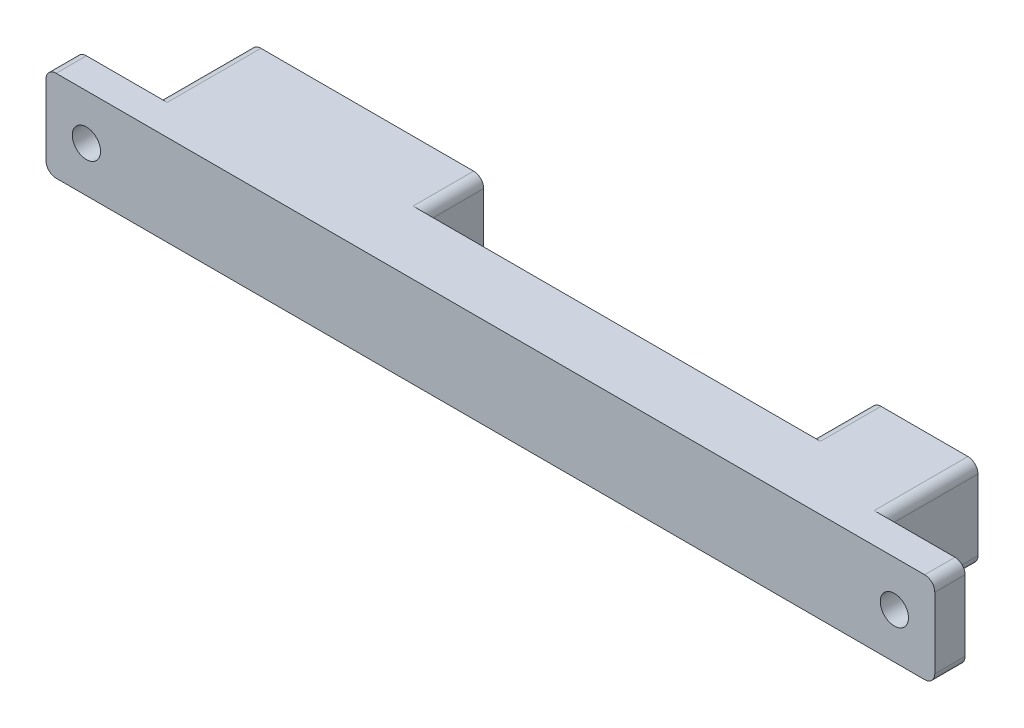
ISO-10303-21;
HEADER;
FILE_DESCRIPTION(('STEP AP214'),'2;1');
FILE_NAME('part.step','',(''),(''),'','','');
FILE_SCHEMA(('AUTOMOTIVE_DESIGN { 1 0 10303 214 1 1 1 1 }'));
ENDSEC;
DATA;
#1=APPLICATION_CONTEXT('core data for automotive mechanical design processes');
#2=APPLICATION_PROTOCOL_DEFINITION('international standard','automotive_design',2000,#1);
#3=PRODUCT_CONTEXT('',#1,'mechanical');
#4=PRODUCT('Part','Part','',(#3));
#5=PRODUCT_RELATED_PRODUCT_CATEGORY('part','',(#4));
#6=PRODUCT_DEFINITION_FORMATION('','',#4);
#7=PRODUCT_DEFINITION_CONTEXT('part definition',#1,'design');
#8=PRODUCT_DEFINITION('design','',#6,#7);
#9=PRODUCT_DEFINITION_SHAPE('','',#8);
#10=(LENGTH_UNIT() NAMED_UNIT(*) SI_UNIT(.MILLI.,.METRE.));
#11=(NAMED_UNIT(*) PLANE_ANGLE_UNIT() SI_UNIT($,.RADIAN.));
#12=(NAMED_UNIT(*) SI_UNIT($,.STERADIAN.) SOLID_ANGLE_UNIT());
#13=UNCERTAINTY_MEASURE_WITH_UNIT(LENGTH_MEASURE(1.E-05),#10,'distance_accuracy_value','');
#14=(GEOMETRIC_REPRESENTATION_CONTEXT(3) GLOBAL_UNCERTAINTY_ASSIGNED_CONTEXT((#13)) GLOBAL_UNIT_ASSIGNED_CONTEXT((#10,
#11,#12)) REPRESENTATION_CONTEXT('',''));
#15=CARTESIAN_POINT('',(0.,0.,0.));
#16=DIRECTION('',(0.,0.,1.));
#17=DIRECTION('',(1.,0.,0.));
#18=AXIS2_PLACEMENT_3D('',#15,#16,#17);
#19=CARTESIAN_POINT('',(-36.,0.,84.840319734687));
#20=DIRECTION('',(1.,0.,0.));
#21=DIRECTION('',(0.,0.,-1.));
#22=AXIS2_PLACEMENT_3D('',#19,#20,#21);
#23=PLANE('',#22);
#24=DIRECTION('',(0.,-1.,0.));
#25=VECTOR('',#24,1.);
#26=CARTESIAN_POINT('',(-36.,0.,0.));
#27=LINE('',#26,#25);
#28=CARTESIAN_POINT('',(-36.,27.4,0.));
#29=VERTEX_POINT('',#28);
#30=CARTESIAN_POINT('',(-36.,20.4,0.));
#31=VERTEX_POINT('',#30);
#32=EDGE_CURVE('E491',#29,#31,#27,.T.);
#33=ORIENTED_EDGE('',*,*,#32,.T.);
#34=DIRECTION('',(0.,0.,-1.));
#35=VECTOR('',#34,1.);
#36=CARTESIAN_POINT('',(-36.,20.4,84.840319734687));
#37=LINE('',#36,#35);
#38=CARTESIAN_POINT('',(-36.,20.4,9.28));
#39=VERTEX_POINT('',#38);
#40=EDGE_CURVE('E304',#31,#39,#37,.F.);
#41=ORIENTED_EDGE('',*,*,#40,.T.);
#42=DIRECTION('',(0.,-1.,0.));
#43=VECTOR('',#42,1.);
#44=CARTESIAN_POINT('',(-36.,0.,9.28));
#45=LINE('',#44,#43);
#46=CARTESIAN_POINT('',(-36.,27.4,9.28));
#47=VERTEX_POINT('',#46);
#48=EDGE_CURVE('E545',#47,#39,#45,.T.);
#49=ORIENTED_EDGE('',*,*,#48,.F.);
#50=DIRECTION('',(0.,0.,-1.));
#51=VECTOR('',#50,1.);
#52=CARTESIAN_POINT('',(-36.,27.4,0.));
#53=LINE('',#52,#51);
#54=EDGE_CURVE('E301',#47,#29,#53,.T.);
#55=ORIENTED_EDGE('',*,*,#54,.T.);
#56=EDGE_LOOP('',(#33,#41,#49,#55));
#57=FACE_BOUND('',#56,.T.);
#58=ADVANCED_FACE('F43',(#57),#23,.F.);
#59=CARTESIAN_POINT('',(0.,0.,0.));
#60=DIRECTION('',(0.,0.,1.));
#61=DIRECTION('',(1.,0.,0.));
#62=AXIS2_PLACEMENT_3D('',#59,#60,#61);
#63=PLANE('',#62);
#64=CARTESIAN_POINT('',(32.,23.9,0.));
#65=DIRECTION('',(0.,0.,1.));
#66=DIRECTION('',(1.,0.,0.));
#67=AXIS2_PLACEMENT_3D('',#64,#65,#66);
#68=CIRCLE('',#67,2.29999999999999);
#69=CARTESIAN_POINT('',(34.3,23.9,0.));
#70=VERTEX_POINT('',#69);
#71=EDGE_CURVE('E332',#70,#70,#68,.T.);
#72=ORIENTED_EDGE('',*,*,#71,.T.);
#73=EDGE_LOOP('',(#72));
#74=FACE_BOUND('',#73,.T.);
#75=DIRECTION('',(0.,1.,0.));
#76=VECTOR('',#75,1.);
#77=CARTESIAN_POINT('',(25.4,0.,0.));
#78=LINE('',#77,#76);
#79=CARTESIAN_POINT('',(25.4,20.4,0.));
#80=VERTEX_POINT('',#79);
#81=CARTESIAN_POINT('',(25.4,27.4,0.));
#82=VERTEX_POINT('',#81);
#83=EDGE_CURVE('E212',#80,#82,#78,.T.);
#84=ORIENTED_EDGE('',*,*,#83,.T.);
#85=CARTESIAN_POINT('',(26.4,27.4,0.));
#86=DIRECTION('',(0.,0.,1.));
#87=DIRECTION('',(1.,0.,0.));
#88=AXIS2_PLACEMENT_3D('',#85,#86,#87);
#89=CIRCLE('',#88,1.);
#90=CARTESIAN_POINT('',(26.4,28.4,0.));
#91=VERTEX_POINT('',#90);
#92=EDGE_CURVE('E207',#82,#91,#89,.F.);
#93=ORIENTED_EDGE('',*,*,#92,.T.);
#94=DIRECTION('',(1.,0.,0.));
#95=VECTOR('',#94,1.);
#96=CARTESIAN_POINT('',(0.,28.4,0.));
#97=LINE('',#96,#95);
#98=CARTESIAN_POINT('',(35.,28.4,0.));
#99=VERTEX_POINT('',#98);
#100=EDGE_CURVE('E210',#91,#99,#97,.T.);
#101=ORIENTED_EDGE('',*,*,#100,.T.);
#102=CARTESIAN_POINT('',(35.,27.4,0.));
#103=DIRECTION('',(0.,0.,1.));
#104=DIRECTION('',(1.,0.,0.));
#105=AXIS2_PLACEMENT_3D('',#102,#103,#104);
#106=CIRCLE('',#105,1.);
#107=CARTESIAN_POINT('',(36.,27.4,0.));
#108=VERTEX_POINT('',#107);
#109=EDGE_CURVE('E277',#99,#108,#106,.F.);
#110=ORIENTED_EDGE('',*,*,#109,.T.);
#111=DIRECTION('',(0.,-1.,0.));
#112=VECTOR('',#111,1.);
#113=CARTESIAN_POINT('',(36.,0.,0.));
#114=LINE('',#113,#112);
#115=CARTESIAN_POINT('',(36.,20.4,0.));
#116=VERTEX_POINT('',#115);
#117=EDGE_CURVE('E486',#108,#116,#114,.T.);
#118=ORIENTED_EDGE('',*,*,#117,.T.);
#119=CARTESIAN_POINT('',(35.,20.4,0.));
#120=DIRECTION('',(0.,0.,1.));
#121=DIRECTION('',(1.,0.,0.));
#122=AXIS2_PLACEMENT_3D('',#119,#120,#121);
#123=CIRCLE('',#122,1.);
#124=CARTESIAN_POINT('',(35.,19.4,0.));
#125=VERTEX_POINT('',#124);
#126=EDGE_CURVE('E275',#116,#125,#123,.F.);
#127=ORIENTED_EDGE('',*,*,#126,.T.);
#128=DIRECTION('',(1.,0.,0.));
#129=VECTOR('',#128,1.);
#130=CARTESIAN_POINT('',(0.,19.4,0.));
#131=LINE('',#130,#129);
#132=CARTESIAN_POINT('',(26.4,19.4,0.));
#133=VERTEX_POINT('',#132);
#134=EDGE_CURVE('E493',#133,#125,#131,.T.);
#135=ORIENTED_EDGE('',*,*,#134,.F.);
#136=CARTESIAN_POINT('',(26.4,20.4,0.));
#137=DIRECTION('',(0.,0.,1.));
#138=DIRECTION('',(1.,0.,0.));
#139=AXIS2_PLACEMENT_3D('',#136,#137,#138);
#140=CIRCLE('',#139,1.);
#141=EDGE_CURVE('E218',#133,#80,#140,.F.);
#142=ORIENTED_EDGE('',*,*,#141,.T.);
#143=EDGE_LOOP('',(#84,#93,#101,#110,#118,#127,#135,#142));
#144=FACE_BOUND('',#143,.T.);
#145=ADVANCED_FACE('F209',(#74,#144),#63,.F.);
#146=CARTESIAN_POINT('',(0.,19.4,84.840319734687));
#147=DIRECTION('',(0.,1.,0.));
#148=DIRECTION('',(0.,0.,1.));
#149=AXIS2_PLACEMENT_3D('',#146,#147,#148);
#150=PLANE('',#149);
#151=CARTESIAN_POINT('',(-35.,19.4,0.));
#152=VERTEX_POINT('',#151);
#153=CARTESIAN_POINT('',(-13.94,19.4,0.));
#154=VERTEX_POINT('',#153);
#155=EDGE_CURVE('E496',#152,#154,#131,.T.);
#156=ORIENTED_EDGE('',*,*,#155,.T.);
#157=DIRECTION('',(0.,0.,-1.));
#158=VECTOR('',#157,1.);
#159=CARTESIAN_POINT('',(-13.94,19.4,84.840319734687));
#160=LINE('',#159,#158);
#161=CARTESIAN_POINT('',(-13.94,19.4,6.));
#162=VERTEX_POINT('',#161);
#163=EDGE_CURVE('E268',#154,#162,#160,.F.);
#164=ORIENTED_EDGE('',*,*,#163,.T.);
#165=DIRECTION('',(1.,0.,0.));
#166=VECTOR('',#165,1.);
#167=CARTESIAN_POINT('',(0.,19.4,6.));
#168=LINE('',#167,#166);
#169=CARTESIAN_POINT('',(26.4,19.4,6.));
#170=VERTEX_POINT('',#169);
#171=EDGE_CURVE('E470',#162,#170,#168,.T.);
#172=ORIENTED_EDGE('',*,*,#171,.T.);
#173=DIRECTION('',(0.,0.,-1.));
#174=VECTOR('',#173,1.);
#175=CARTESIAN_POINT('',(26.4,19.4,0.));
#176=LINE('',#175,#174);
#177=EDGE_CURVE('E265',#170,#133,#176,.T.);
#178=ORIENTED_EDGE('',*,*,#177,.T.);
#179=ORIENTED_EDGE('',*,*,#134,.T.);
#180=DIRECTION('',(0.,0.,-1.));
#181=VECTOR('',#180,1.);
#182=CARTESIAN_POINT('',(35.,19.4,9.28));
#183=LINE('',#182,#181);
#184=CARTESIAN_POINT('',(35.,19.4,9.28));
#185=VERTEX_POINT('',#184);
#186=EDGE_CURVE('E262',#125,#185,#183,.F.);
#187=ORIENTED_EDGE('',*,*,#186,.T.);
#188=DIRECTION('',(1.,0.,0.));
#189=VECTOR('',#188,1.);
#190=CARTESIAN_POINT('',(0.,19.4,9.28));
#191=LINE('',#190,#189);
#192=CARTESIAN_POINT('',(43.,19.4,9.28));
#193=VERTEX_POINT('',#192);
#194=EDGE_CURVE('E446',#185,#193,#191,.T.);
#195=ORIENTED_EDGE('',*,*,#194,.T.);
#196=DIRECTION('',(0.,0.,1.));
#197=VECTOR('',#196,1.);
#198=CARTESIAN_POINT('',(43.,19.4,12.28));
#199=LINE('',#198,#197);
#200=CARTESIAN_POINT('',(43.,19.4,12.28));
#201=VERTEX_POINT('',#200);
#202=EDGE_CURVE('E259',#193,#201,#199,.T.);
#203=ORIENTED_EDGE('',*,*,#202,.T.);
#204=DIRECTION('',(1.,0.,0.));
#205=VECTOR('',#204,1.);
#206=CARTESIAN_POINT('',(0.,19.4,12.28));
#207=LINE('',#206,#205);
#208=CARTESIAN_POINT('',(-43.,19.4,12.28));
#209=VERTEX_POINT('',#208);
#210=EDGE_CURVE('E483',#209,#201,#207,.T.);
#211=ORIENTED_EDGE('',*,*,#210,.F.);
#212=DIRECTION('',(0.,0.,1.));
#213=VECTOR('',#212,1.);
#214=CARTESIAN_POINT('',(-43.,19.4,84.840319734687));
#215=LINE('',#214,#213);
#216=CARTESIAN_POINT('',(-43.,19.4,9.28));
#217=VERTEX_POINT('',#216);
#218=EDGE_CURVE('E254',#209,#217,#215,.F.);
#219=ORIENTED_EDGE('',*,*,#218,.T.);
#220=DIRECTION('',(-1.,0.,0.));
#221=VECTOR('',#220,1.);
#222=CARTESIAN_POINT('',(0.,19.4,9.28));
#223=LINE('',#222,#221);
#224=CARTESIAN_POINT('',(-35.,19.4,9.28));
#225=VERTEX_POINT('',#224);
#226=EDGE_CURVE('E547',#225,#217,#223,.T.);
#227=ORIENTED_EDGE('',*,*,#226,.F.);
#228=DIRECTION('',(0.,0.,-1.));
#229=VECTOR('',#228,1.);
#230=CARTESIAN_POINT('',(-35.,19.4,84.840319734687));
#231=LINE('',#230,#229);
#232=EDGE_CURVE('E256',#225,#152,#231,.T.);
#233=ORIENTED_EDGE('',*,*,#232,.T.);
#234=EDGE_LOOP('',(#156,#164,#172,#178,#179,#187,#195,#203,#211,#219,#227,#233));
#235=FACE_BOUND('',#234,.T.);
#236=ADVANCED_FACE('F360',(#235),#150,.F.);
#237=CARTESIAN_POINT('',(0.,28.4,84.840319734687));
#238=DIRECTION('',(0.,1.,0.));
#239=DIRECTION('',(0.,0.,1.));
#240=AXIS2_PLACEMENT_3D('',#237,#238,#239);
#241=PLANE('',#240);
#242=DIRECTION('',(1.,0.,0.));
#243=VECTOR('',#242,1.);
#244=CARTESIAN_POINT('',(0.,28.4,6.));
#245=LINE('',#244,#243);
#246=CARTESIAN_POINT('',(-13.94,28.4,6.));
#247=VERTEX_POINT('',#246);
#248=CARTESIAN_POINT('',(26.4,28.4,6.));
#249=VERTEX_POINT('',#248);
#250=EDGE_CURVE('E476',#247,#249,#245,.T.);
#251=ORIENTED_EDGE('',*,*,#250,.F.);
#252=DIRECTION('',(0.,0.,-1.));
#253=VECTOR('',#252,1.);
#254=CARTESIAN_POINT('',(-13.94,28.4,0.));
#255=LINE('',#254,#253);
#256=CARTESIAN_POINT('',(-13.94,28.4,0.));
#257=VERTEX_POINT('',#256);
#258=EDGE_CURVE('E233',#247,#257,#255,.T.);
#259=ORIENTED_EDGE('',*,*,#258,.T.);
#260=CARTESIAN_POINT('',(-35.,28.4,0.));
#261=VERTEX_POINT('',#260);
#262=EDGE_CURVE('E228',#261,#257,#97,.T.);
#263=ORIENTED_EDGE('',*,*,#262,.F.);
#264=DIRECTION('',(0.,0.,-1.));
#265=VECTOR('',#264,1.);
#266=CARTESIAN_POINT('',(-35.,28.4,9.28));
#267=LINE('',#266,#265);
#268=CARTESIAN_POINT('',(-35.,28.4,9.28));
#269=VERTEX_POINT('',#268);
#270=EDGE_CURVE('E501',#261,#269,#267,.F.);
#271=ORIENTED_EDGE('',*,*,#270,.T.);
#272=DIRECTION('',(-1.,0.,0.));
#273=VECTOR('',#272,1.);
#274=CARTESIAN_POINT('',(0.,28.4,9.28));
#275=LINE('',#274,#273);
#276=CARTESIAN_POINT('',(-43.,28.4,9.28));
#277=VERTEX_POINT('',#276);
#278=EDGE_CURVE('E469',#269,#277,#275,.T.);
#279=ORIENTED_EDGE('',*,*,#278,.T.);
#280=DIRECTION('',(0.,0.,1.));
#281=VECTOR('',#280,1.);
#282=CARTESIAN_POINT('',(-43.,28.4,12.28));
#283=LINE('',#282,#281);
#284=CARTESIAN_POINT('',(-43.,28.4,12.28));
#285=VERTEX_POINT('',#284);
#286=EDGE_CURVE('E488',#277,#285,#283,.T.);
#287=ORIENTED_EDGE('',*,*,#286,.T.);
#288=DIRECTION('',(1.,0.,0.));
#289=VECTOR('',#288,1.);
#290=CARTESIAN_POINT('',(0.,28.4,12.28));
#291=LINE('',#290,#289);
#292=CARTESIAN_POINT('',(43.,28.4,12.28));
#293=VERTEX_POINT('',#292);
#294=EDGE_CURVE('E485',#285,#293,#291,.T.);
#295=ORIENTED_EDGE('',*,*,#294,.T.);
#296=DIRECTION('',(0.,0.,1.));
#297=VECTOR('',#296,1.);
#298=CARTESIAN_POINT('',(43.,28.4,84.840319734687));
#299=LINE('',#298,#297);
#300=CARTESIAN_POINT('',(43.,28.4,9.28));
#301=VERTEX_POINT('',#300);
#302=EDGE_CURVE('E238',#293,#301,#299,.F.);
#303=ORIENTED_EDGE('',*,*,#302,.T.);
#304=DIRECTION('',(1.,0.,0.));
#305=VECTOR('',#304,1.);
#306=CARTESIAN_POINT('',(0.,28.4,9.28));
#307=LINE('',#306,#305);
#308=CARTESIAN_POINT('',(35.,28.4,9.28));
#309=VERTEX_POINT('',#308);
#310=EDGE_CURVE('E453',#309,#301,#307,.T.);
#311=ORIENTED_EDGE('',*,*,#310,.F.);
#312=DIRECTION('',(0.,0.,-1.));
#313=VECTOR('',#312,1.);
#314=CARTESIAN_POINT('',(35.,28.4,84.840319734687));
#315=LINE('',#314,#313);
#316=EDGE_CURVE('E227',#309,#99,#315,.T.);
#317=ORIENTED_EDGE('',*,*,#316,.T.);
#318=ORIENTED_EDGE('',*,*,#100,.F.);
#319=DIRECTION('',(0.,0.,-1.));
#320=VECTOR('',#319,1.);
#321=CARTESIAN_POINT('',(26.4,28.4,84.840319734687));
#322=LINE('',#321,#320);
#323=EDGE_CURVE('E224',#91,#249,#322,.F.);
#324=ORIENTED_EDGE('',*,*,#323,.T.);
#325=EDGE_LOOP('',(#251,#259,#263,#271,#279,#287,#295,#303,#311,#317,#318,#324));
#326=FACE_BOUND('',#325,.T.);
#327=ADVANCED_FACE('F223',(#326),#241,.T.);
#328=CARTESIAN_POINT('',(-32.,23.9,0.));
#329=DIRECTION('',(0.,0.,1.));
#330=DIRECTION('',(1.,0.,0.));
#331=AXIS2_PLACEMENT_3D('',#328,#329,#330);
#332=CIRCLE('',#331,2.29999999999999);
#333=CARTESIAN_POINT('',(-29.7,23.9,0.));
#334=VERTEX_POINT('',#333);
#335=EDGE_CURVE('E52',#334,#334,#332,.T.);
#336=ORIENTED_EDGE('',*,*,#335,.T.);
#337=EDGE_LOOP('',(#336));
#338=FACE_BOUND('',#337,.T.);
#339=ORIENTED_EDGE('',*,*,#262,.T.);
#340=CARTESIAN_POINT('',(-13.94,27.4,0.));
#341=DIRECTION('',(0.,0.,1.));
#342=DIRECTION('',(1.,0.,0.));
#343=AXIS2_PLACEMENT_3D('',#340,#341,#342);
#344=CIRCLE('',#343,1.);
#345=CARTESIAN_POINT('',(-12.94,27.4,0.));
#346=VERTEX_POINT('',#345);
#347=EDGE_CURVE('E247',#257,#346,#344,.F.);
#348=ORIENTED_EDGE('',*,*,#347,.T.);
#349=DIRECTION('',(0.,1.,0.));
#350=VECTOR('',#349,1.);
#351=CARTESIAN_POINT('',(-12.94,0.,0.));
#352=LINE('',#351,#350);
#353=CARTESIAN_POINT('',(-12.94,20.4,0.));
#354=VERTEX_POINT('',#353);
#355=EDGE_CURVE('E473',#354,#346,#352,.T.);
#356=ORIENTED_EDGE('',*,*,#355,.F.);
#357=CARTESIAN_POINT('',(-13.94,20.4,0.));
#358=DIRECTION('',(0.,0.,1.));
#359=DIRECTION('',(1.,0.,0.));
#360=AXIS2_PLACEMENT_3D('',#357,#358,#359);
#361=CIRCLE('',#360,1.);
#362=EDGE_CURVE('E245',#354,#154,#361,.F.);
#363=ORIENTED_EDGE('',*,*,#362,.T.);
#364=ORIENTED_EDGE('',*,*,#155,.F.);
#365=CARTESIAN_POINT('',(-35.,20.4,0.));
#366=DIRECTION('',(0.,0.,1.));
#367=DIRECTION('',(1.,0.,0.));
#368=AXIS2_PLACEMENT_3D('',#365,#366,#367);
#369=CIRCLE('',#368,1.);
#370=EDGE_CURVE('E243',#152,#31,#369,.F.);
#371=ORIENTED_EDGE('',*,*,#370,.T.);
#372=ORIENTED_EDGE('',*,*,#32,.F.);
#373=CARTESIAN_POINT('',(-35.,27.4,0.));
#374=DIRECTION('',(0.,0.,1.));
#375=DIRECTION('',(1.,0.,0.));
#376=AXIS2_PLACEMENT_3D('',#373,#374,#375);
#377=CIRCLE('',#376,1.);
#378=EDGE_CURVE('E236',#29,#261,#377,.F.);
#379=ORIENTED_EDGE('',*,*,#378,.T.);
#380=EDGE_LOOP('',(#339,#348,#356,#363,#364,#371,#372,#379));
#381=FACE_BOUND('',#380,.T.);
#382=ADVANCED_FACE('F340',(#338,#381),#63,.F.);
#383=CARTESIAN_POINT('',(36.,0.,84.840319734687));
#384=DIRECTION('',(1.,0.,0.));
#385=DIRECTION('',(0.,0.,-1.));
#386=AXIS2_PLACEMENT_3D('',#383,#384,#385);
#387=PLANE('',#386);
#388=ORIENTED_EDGE('',*,*,#117,.F.);
#389=DIRECTION('',(0.,0.,-1.));
#390=VECTOR('',#389,1.);
#391=CARTESIAN_POINT('',(36.,27.4,84.840319734687));
#392=LINE('',#391,#390);
#393=CARTESIAN_POINT('',(36.,27.4,9.28));
#394=VERTEX_POINT('',#393);
#395=EDGE_CURVE('E282',#108,#394,#392,.F.);
#396=ORIENTED_EDGE('',*,*,#395,.T.);
#397=DIRECTION('',(0.,1.,0.));
#398=VECTOR('',#397,1.);
#399=CARTESIAN_POINT('',(36.,0.,9.28));
#400=LINE('',#399,#398);
#401=CARTESIAN_POINT('',(36.,20.4,9.28));
#402=VERTEX_POINT('',#401);
#403=EDGE_CURVE('E439',#402,#394,#400,.T.);
#404=ORIENTED_EDGE('',*,*,#403,.F.);
#405=DIRECTION('',(0.,0.,-1.));
#406=VECTOR('',#405,1.);
#407=CARTESIAN_POINT('',(36.,20.4,0.));
#408=LINE('',#407,#406);
#409=EDGE_CURVE('E217',#402,#116,#408,.T.);
#410=ORIENTED_EDGE('',*,*,#409,.T.);
#411=EDGE_LOOP('',(#388,#396,#404,#410));
#412=FACE_BOUND('',#411,.T.);
#413=ADVANCED_FACE('F523',(#412),#387,.T.);
#414=CARTESIAN_POINT('',(-18.6226918113002,29.4606526095627,12.28));
#415=DIRECTION('',(0.,0.,1.));
#416=DIRECTION('',(1.,0.,0.));
#417=AXIS2_PLACEMENT_3D('',#414,#415,#416);
#418=PLANE('',#417);
#419=ORIENTED_EDGE('',*,*,#210,.T.);
#420=CARTESIAN_POINT('',(43.,20.4,12.28));
#421=DIRECTION('',(0.,0.,1.));
#422=DIRECTION('',(1.,0.,0.));
#423=AXIS2_PLACEMENT_3D('',#420,#421,#422);
#424=CIRCLE('',#423,1.);
#425=CARTESIAN_POINT('',(44.,20.4,12.28));
#426=VERTEX_POINT('',#425);
#427=EDGE_CURVE('E290',#201,#426,#424,.T.);
#428=ORIENTED_EDGE('',*,*,#427,.T.);
#429=DIRECTION('',(0.,1.,0.));
#430=VECTOR('',#429,1.);
#431=CARTESIAN_POINT('',(44.,0.,12.28));
#432=LINE('',#431,#430);
#433=CARTESIAN_POINT('',(44.,27.4,12.28));
#434=VERTEX_POINT('',#433);
#435=EDGE_CURVE('E447',#426,#434,#432,.T.);
#436=ORIENTED_EDGE('',*,*,#435,.T.);
#437=CARTESIAN_POINT('',(43.,27.4,12.28));
#438=DIRECTION('',(0.,0.,1.));
#439=DIRECTION('',(1.,0.,0.));
#440=AXIS2_PLACEMENT_3D('',#437,#438,#439);
#441=CIRCLE('',#440,1.);
#442=EDGE_CURVE('E288',#434,#293,#441,.T.);
#443=ORIENTED_EDGE('',*,*,#442,.T.);
#444=ORIENTED_EDGE('',*,*,#294,.F.);
#445=CARTESIAN_POINT('',(-43.,27.4,12.28));
#446=DIRECTION('',(0.,0.,1.));
#447=DIRECTION('',(1.,0.,0.));
#448=AXIS2_PLACEMENT_3D('',#445,#446,#447);
#449=CIRCLE('',#448,1.);
#450=CARTESIAN_POINT('',(-44.,27.4,12.28));
#451=VERTEX_POINT('',#450);
#452=EDGE_CURVE('E286',#285,#451,#449,.T.);
#453=ORIENTED_EDGE('',*,*,#452,.T.);
#454=DIRECTION('',(0.,1.,0.));
#455=VECTOR('',#454,1.);
#456=CARTESIAN_POINT('',(-44.,0.,12.28));
#457=LINE('',#456,#455);
#458=CARTESIAN_POINT('',(-44.,20.4,12.28));
#459=VERTEX_POINT('',#458);
#460=EDGE_CURVE('E425',#459,#451,#457,.T.);
#461=ORIENTED_EDGE('',*,*,#460,.F.);
#462=CARTESIAN_POINT('',(-43.,20.4,12.28));
#463=DIRECTION('',(0.,0.,1.));
#464=DIRECTION('',(1.,0.,0.));
#465=AXIS2_PLACEMENT_3D('',#462,#463,#464);
#466=CIRCLE('',#465,1.);
#467=EDGE_CURVE('E284',#459,#209,#466,.T.);
#468=ORIENTED_EDGE('',*,*,#467,.T.);
#469=EDGE_LOOP('',(#419,#428,#436,#443,#444,#453,#461,#468));
#470=FACE_BOUND('',#469,.T.);
#471=CARTESIAN_POINT('',(-40.,23.9,12.28));
#472=DIRECTION('',(0.,0.,1.));
#473=DIRECTION('',(1.,0.,0.));
#474=AXIS2_PLACEMENT_3D('',#471,#472,#473);
#475=CIRCLE('',#474,1.4);
#476=CARTESIAN_POINT('',(-38.6,23.9,12.28));
#477=VERTEX_POINT('',#476);
#478=EDGE_CURVE('E434',#477,#477,#475,.T.);
#479=ORIENTED_EDGE('',*,*,#478,.F.);
#480=EDGE_LOOP('',(#479));
#481=FACE_BOUND('',#480,.T.);
#482=CARTESIAN_POINT('',(40.,23.9,12.28));
#483=DIRECTION('',(0.,0.,1.));
#484=DIRECTION('',(1.,0.,0.));
#485=AXIS2_PLACEMENT_3D('',#482,#483,#484);
#486=CIRCLE('',#485,1.4);
#487=CARTESIAN_POINT('',(41.4,23.9,12.28));
#488=VERTEX_POINT('',#487);
#489=EDGE_CURVE('E458',#488,#488,#486,.T.);
#490=ORIENTED_EDGE('',*,*,#489,.F.);
#491=EDGE_LOOP('',(#490));
#492=FACE_BOUND('',#491,.T.);
#493=ADVANCED_FACE('F429',(#470,#481,#492),#418,.T.);
#494=CARTESIAN_POINT('',(25.4,0.,6.));
#495=DIRECTION('',(-1.,0.,0.));
#496=DIRECTION('',(0.,0.,1.));
#497=AXIS2_PLACEMENT_3D('',#494,#495,#496);
#498=PLANE('',#497);
#499=DIRECTION('',(0.,1.,0.));
#500=VECTOR('',#499,1.);
#501=CARTESIAN_POINT('',(25.4,0.,6.));
#502=LINE('',#501,#500);
#503=CARTESIAN_POINT('',(25.4,20.4,6.));
#504=VERTEX_POINT('',#503);
#505=CARTESIAN_POINT('',(25.4,27.4,6.));
#506=VERTEX_POINT('',#505);
#507=EDGE_CURVE('E472',#504,#506,#502,.T.);
#508=ORIENTED_EDGE('',*,*,#507,.T.);
#509=DIRECTION('',(0.,0.,-1.));
#510=VECTOR('',#509,1.);
#511=CARTESIAN_POINT('',(25.4,27.4,6.));
#512=LINE('',#511,#510);
#513=EDGE_CURVE('E273',#506,#82,#512,.T.);
#514=ORIENTED_EDGE('',*,*,#513,.T.);
#515=ORIENTED_EDGE('',*,*,#83,.F.);
#516=DIRECTION('',(0.,0.,-1.));
#517=VECTOR('',#516,1.);
#518=CARTESIAN_POINT('',(25.4,20.4,6.00000000000001));
#519=LINE('',#518,#517);
#520=EDGE_CURVE('E271',#80,#504,#519,.F.);
#521=ORIENTED_EDGE('',*,*,#520,.T.);
#522=EDGE_LOOP('',(#508,#514,#515,#521));
#523=FACE_BOUND('',#522,.T.);
#524=ADVANCED_FACE('F530',(#523),#498,.T.);
#525=CARTESIAN_POINT('',(-12.94,0.,6.));
#526=DIRECTION('',(-1.,0.,0.));
#527=DIRECTION('',(0.,0.,1.));
#528=AXIS2_PLACEMENT_3D('',#525,#526,#527);
#529=PLANE('',#528);
#530=ORIENTED_EDGE('',*,*,#355,.T.);
#531=DIRECTION('',(0.,0.,-1.));
#532=VECTOR('',#531,1.);
#533=CARTESIAN_POINT('',(-12.94,27.4,6.00000000000001));
#534=LINE('',#533,#532);
#535=CARTESIAN_POINT('',(-12.94,27.4,6.));
#536=VERTEX_POINT('',#535);
#537=EDGE_CURVE('E252',#346,#536,#534,.F.);
#538=ORIENTED_EDGE('',*,*,#537,.T.);
#539=DIRECTION('',(0.,1.,0.));
#540=VECTOR('',#539,1.);
#541=CARTESIAN_POINT('',(-12.94,0.,6.));
#542=LINE('',#541,#540);
#543=CARTESIAN_POINT('',(-12.94,20.4,6.));
#544=VERTEX_POINT('',#543);
#545=EDGE_CURVE('E229',#544,#536,#542,.T.);
#546=ORIENTED_EDGE('',*,*,#545,.F.);
#547=DIRECTION('',(0.,0.,-1.));
#548=VECTOR('',#547,1.);
#549=CARTESIAN_POINT('',(-12.94,20.4,6.));
#550=LINE('',#549,#548);
#551=EDGE_CURVE('E249',#544,#354,#550,.T.);
#552=ORIENTED_EDGE('',*,*,#551,.T.);
#553=EDGE_LOOP('',(#530,#538,#546,#552));
#554=FACE_BOUND('',#553,.T.);
#555=ADVANCED_FACE('F593',(#554),#529,.F.);
#556=CARTESIAN_POINT('',(0.,0.,6.));
#557=DIRECTION('',(0.,0.,1.));
#558=DIRECTION('',(1.,0.,0.));
#559=AXIS2_PLACEMENT_3D('',#556,#557,#558);
#560=PLANE('',#559);
#561=ORIENTED_EDGE('',*,*,#171,.F.);
#562=CARTESIAN_POINT('',(-13.94,20.4,6.));
#563=DIRECTION('',(0.,0.,1.));
#564=DIRECTION('',(1.,0.,0.));
#565=AXIS2_PLACEMENT_3D('',#562,#563,#564);
#566=CIRCLE('',#565,1.);
#567=EDGE_CURVE('E316',#162,#544,#566,.T.);
#568=ORIENTED_EDGE('',*,*,#567,.T.);
#569=ORIENTED_EDGE('',*,*,#545,.T.);
#570=CARTESIAN_POINT('',(-13.94,27.4,6.00000000000001));
#571=DIRECTION('',(0.,0.,1.));
#572=DIRECTION('',(1.,0.,0.));
#573=AXIS2_PLACEMENT_3D('',#570,#571,#572);
#574=CIRCLE('',#573,1.);
#575=EDGE_CURVE('E313',#536,#247,#574,.T.);
#576=ORIENTED_EDGE('',*,*,#575,.T.);
#577=ORIENTED_EDGE('',*,*,#250,.T.);
#578=CARTESIAN_POINT('',(26.4,27.4,6.));
#579=DIRECTION('',(0.,0.,1.));
#580=DIRECTION('',(1.,0.,0.));
#581=AXIS2_PLACEMENT_3D('',#578,#579,#580);
#582=CIRCLE('',#581,1.);
#583=EDGE_CURVE('E232',#249,#506,#582,.T.);
#584=ORIENTED_EDGE('',*,*,#583,.T.);
#585=ORIENTED_EDGE('',*,*,#507,.F.);
#586=CARTESIAN_POINT('',(26.4,20.4,6.00000000000001));
#587=DIRECTION('',(0.,0.,1.));
#588=DIRECTION('',(1.,0.,0.));
#589=AXIS2_PLACEMENT_3D('',#586,#587,#588);
#590=CIRCLE('',#589,1.);
#591=EDGE_CURVE('E319',#504,#170,#590,.T.);
#592=ORIENTED_EDGE('',*,*,#591,.T.);
#593=EDGE_LOOP('',(#561,#568,#569,#576,#577,#584,#585,#592));
#594=FACE_BOUND('',#593,.T.);
#595=ADVANCED_FACE('F533',(#594),#560,.F.);
#596=CARTESIAN_POINT('',(-32.,23.9,8.));
#597=DIRECTION('',(0.,0.,-1.));
#598=DIRECTION('',(-1.,0.,0.));
#599=AXIS2_PLACEMENT_3D('',#596,#597,#598);
#600=CYLINDRICAL_SURFACE('',#599,1.8);
#601=CARTESIAN_POINT('',(-32.,23.9,0.499999999999981));
#602=DIRECTION('',(0.,0.,1.));
#603=DIRECTION('',(1.,0.,0.));
#604=AXIS2_PLACEMENT_3D('',#601,#602,#603);
#605=CIRCLE('',#604,1.8);
#606=CARTESIAN_POINT('',(-30.2,23.9,0.499999999999981));
#607=VERTEX_POINT('',#606);
#608=EDGE_CURVE('E11',#607,#607,#605,.F.);
#609=ORIENTED_EDGE('',*,*,#608,.T.);
#610=EDGE_LOOP('',(#609));
#611=FACE_BOUND('',#610,.T.);
#612=CARTESIAN_POINT('',(-32.,23.9,8.));
#613=DIRECTION('',(0.,0.,1.));
#614=DIRECTION('',(1.,0.,0.));
#615=AXIS2_PLACEMENT_3D('',#612,#613,#614);
#616=CIRCLE('',#615,1.8);
#617=CARTESIAN_POINT('',(-30.2,23.9,8.));
#618=VERTEX_POINT('',#617);
#619=EDGE_CURVE('E463',#618,#618,#616,.T.);
#620=ORIENTED_EDGE('',*,*,#619,.T.);
#621=EDGE_LOOP('',(#620));
#622=FACE_BOUND('',#621,.T.);
#623=ADVANCED_FACE('F580',(#611,#622),#600,.F.);
#624=CARTESIAN_POINT('',(0.,0.,8.));
#625=DIRECTION('',(0.,0.,1.));
#626=DIRECTION('',(1.,0.,0.));
#627=AXIS2_PLACEMENT_3D('',#624,#625,#626);
#628=PLANE('',#627);
#629=ORIENTED_EDGE('',*,*,#619,.F.);
#630=EDGE_LOOP('',(#629));
#631=FACE_BOUND('',#630,.T.);
#632=ADVANCED_FACE('F576',(#631),#628,.F.);
#633=CARTESIAN_POINT('',(32.,23.9,8.));
#634=DIRECTION('',(0.,0.,-1.));
#635=DIRECTION('',(-1.,0.,0.));
#636=AXIS2_PLACEMENT_3D('',#633,#634,#635);
#637=CYLINDRICAL_SURFACE('',#636,1.8);
#638=CARTESIAN_POINT('',(32.,23.9,0.499999999999999));
#639=DIRECTION('',(0.,0.,1.));
#640=DIRECTION('',(1.,0.,0.));
#641=AXIS2_PLACEMENT_3D('',#638,#639,#640);
#642=CIRCLE('',#641,1.8);
#643=CARTESIAN_POINT('',(33.8,23.9,0.499999999999999));
#644=VERTEX_POINT('',#643);
#645=EDGE_CURVE('E335',#644,#644,#642,.F.);
#646=ORIENTED_EDGE('',*,*,#645,.T.);
#647=EDGE_LOOP('',(#646));
#648=FACE_BOUND('',#647,.T.);
#649=CARTESIAN_POINT('',(32.,23.9,8.));
#650=DIRECTION('',(0.,0.,1.));
#651=DIRECTION('',(1.,0.,0.));
#652=AXIS2_PLACEMENT_3D('',#649,#650,#651);
#653=CIRCLE('',#652,1.8);
#654=CARTESIAN_POINT('',(33.8,23.9,8.));
#655=VERTEX_POINT('',#654);
#656=EDGE_CURVE('E466',#655,#655,#653,.T.);
#657=ORIENTED_EDGE('',*,*,#656,.T.);
#658=EDGE_LOOP('',(#657));
#659=FACE_BOUND('',#658,.T.);
#660=ADVANCED_FACE('F579',(#648,#659),#637,.F.);
#661=CARTESIAN_POINT('',(0.,0.,8.));
#662=DIRECTION('',(0.,0.,1.));
#663=DIRECTION('',(1.,0.,0.));
#664=AXIS2_PLACEMENT_3D('',#661,#662,#663);
#665=PLANE('',#664);
#666=ORIENTED_EDGE('',*,*,#656,.F.);
#667=EDGE_LOOP('',(#666));
#668=FACE_BOUND('',#667,.T.);
#669=ADVANCED_FACE('F570',(#668),#665,.F.);
#670=CARTESIAN_POINT('',(-44.,0.,9.28));
#671=DIRECTION('',(1.,0.,0.));
#672=DIRECTION('',(0.,0.,-1.));
#673=AXIS2_PLACEMENT_3D('',#670,#671,#672);
#674=PLANE('',#673);
#675=ORIENTED_EDGE('',*,*,#460,.T.);
#676=DIRECTION('',(0.,0.,1.));
#677=VECTOR('',#676,1.);
#678=CARTESIAN_POINT('',(-44.,27.4,9.28));
#679=LINE('',#678,#677);
#680=CARTESIAN_POINT('',(-44.,27.4,9.28));
#681=VERTEX_POINT('',#680);
#682=EDGE_CURVE('E59',#451,#681,#679,.F.);
#683=ORIENTED_EDGE('',*,*,#682,.T.);
#684=DIRECTION('',(0.,1.,0.));
#685=VECTOR('',#684,1.);
#686=CARTESIAN_POINT('',(-44.,0.,9.28));
#687=LINE('',#686,#685);
#688=CARTESIAN_POINT('',(-44.,20.4,9.28));
#689=VERTEX_POINT('',#688);
#690=EDGE_CURVE('E426',#689,#681,#687,.T.);
#691=ORIENTED_EDGE('',*,*,#690,.F.);
#692=DIRECTION('',(0.,0.,1.));
#693=VECTOR('',#692,1.);
#694=CARTESIAN_POINT('',(-44.,20.4,9.28));
#695=LINE('',#694,#693);
#696=EDGE_CURVE('E306',#689,#459,#695,.T.);
#697=ORIENTED_EDGE('',*,*,#696,.T.);
#698=EDGE_LOOP('',(#675,#683,#691,#697));
#699=FACE_BOUND('',#698,.T.);
#700=ADVANCED_FACE('F424',(#699),#674,.F.);
#701=CARTESIAN_POINT('',(-40.,23.9,9.28));
#702=DIRECTION('',(0.,0.,1.));
#703=DIRECTION('',(1.,0.,0.));
#704=AXIS2_PLACEMENT_3D('',#701,#702,#703);
#705=CYLINDRICAL_SURFACE('',#704,1.4);
#706=CARTESIAN_POINT('',(-40.,23.9,9.28));
#707=DIRECTION('',(0.,0.,1.));
#708=DIRECTION('',(1.,0.,0.));
#709=AXIS2_PLACEMENT_3D('',#706,#707,#708);
#710=CIRCLE('',#709,1.4);
#711=CARTESIAN_POINT('',(-38.6,23.9,9.28));
#712=VERTEX_POINT('',#711);
#713=EDGE_CURVE('E433',#712,#712,#710,.T.);
#714=ORIENTED_EDGE('',*,*,#713,.F.);
#715=EDGE_LOOP('',(#714));
#716=FACE_BOUND('',#715,.T.);
#717=ORIENTED_EDGE('',*,*,#478,.T.);
#718=EDGE_LOOP('',(#717));
#719=FACE_BOUND('',#718,.T.);
#720=ADVANCED_FACE('F557',(#716,#719),#705,.F.);
#721=CARTESIAN_POINT('',(0.,0.,9.28));
#722=DIRECTION('',(0.,0.,1.));
#723=DIRECTION('',(1.,0.,0.));
#724=AXIS2_PLACEMENT_3D('',#721,#722,#723);
#725=PLANE('',#724);
#726=ORIENTED_EDGE('',*,*,#713,.T.);
#727=EDGE_LOOP('',(#726));
#728=FACE_BOUND('',#727,.T.);
#729=ORIENTED_EDGE('',*,*,#690,.T.);
#730=CARTESIAN_POINT('',(-43.,27.4,9.28));
#731=DIRECTION('',(0.,0.,1.));
#732=DIRECTION('',(1.,0.,0.));
#733=AXIS2_PLACEMENT_3D('',#730,#731,#732);
#734=CIRCLE('',#733,1.);
#735=EDGE_CURVE('E311',#681,#277,#734,.F.);
#736=ORIENTED_EDGE('',*,*,#735,.T.);
#737=ORIENTED_EDGE('',*,*,#278,.F.);
#738=CARTESIAN_POINT('',(-35.,27.4,9.28));
#739=DIRECTION('',(0.,0.,1.));
#740=DIRECTION('',(1.,0.,0.));
#741=AXIS2_PLACEMENT_3D('',#738,#739,#740);
#742=CIRCLE('',#741,1.);
#743=EDGE_CURVE('E330',#269,#47,#742,.T.);
#744=ORIENTED_EDGE('',*,*,#743,.T.);
#745=ORIENTED_EDGE('',*,*,#48,.T.);
#746=CARTESIAN_POINT('',(-35.,20.4,9.28));
#747=DIRECTION('',(0.,0.,1.));
#748=DIRECTION('',(1.,0.,0.));
#749=AXIS2_PLACEMENT_3D('',#746,#747,#748);
#750=CIRCLE('',#749,1.);
#751=EDGE_CURVE('E327',#39,#225,#750,.T.);
#752=ORIENTED_EDGE('',*,*,#751,.T.);
#753=ORIENTED_EDGE('',*,*,#226,.T.);
#754=CARTESIAN_POINT('',(-43.,20.4,9.28));
#755=DIRECTION('',(0.,0.,1.));
#756=DIRECTION('',(1.,0.,0.));
#757=AXIS2_PLACEMENT_3D('',#754,#755,#756);
#758=CIRCLE('',#757,1.);
#759=EDGE_CURVE('E66',#217,#689,#758,.F.);
#760=ORIENTED_EDGE('',*,*,#759,.T.);
#761=EDGE_LOOP('',(#729,#736,#737,#744,#745,#752,#753,#760));
#762=FACE_BOUND('',#761,.T.);
#763=ADVANCED_FACE('F553',(#728,#762),#725,.F.);
#764=CARTESIAN_POINT('',(40.,23.9,9.28));
#765=DIRECTION('',(0.,0.,1.));
#766=DIRECTION('',(1.,0.,0.));
#767=AXIS2_PLACEMENT_3D('',#764,#765,#766);
#768=CYLINDRICAL_SURFACE('',#767,1.4);
#769=CARTESIAN_POINT('',(40.,23.9,9.28));
#770=DIRECTION('',(0.,0.,1.));
#771=DIRECTION('',(1.,0.,0.));
#772=AXIS2_PLACEMENT_3D('',#769,#770,#771);
#773=CIRCLE('',#772,1.4);
#774=CARTESIAN_POINT('',(41.4,23.9,9.28));
#775=VERTEX_POINT('',#774);
#776=EDGE_CURVE('E443',#775,#775,#773,.T.);
#777=ORIENTED_EDGE('',*,*,#776,.F.);
#778=EDGE_LOOP('',(#777));
#779=FACE_BOUND('',#778,.T.);
#780=ORIENTED_EDGE('',*,*,#489,.T.);
#781=EDGE_LOOP('',(#780));
#782=FACE_BOUND('',#781,.T.);
#783=ADVANCED_FACE('F556',(#779,#782),#768,.F.);
#784=CARTESIAN_POINT('',(44.,0.,9.28));
#785=DIRECTION('',(1.,0.,0.));
#786=DIRECTION('',(0.,0.,-1.));
#787=AXIS2_PLACEMENT_3D('',#784,#785,#786);
#788=PLANE('',#787);
#789=ORIENTED_EDGE('',*,*,#435,.F.);
#790=DIRECTION('',(0.,0.,1.));
#791=VECTOR('',#790,1.);
#792=CARTESIAN_POINT('',(44.,20.4,9.28));
#793=LINE('',#792,#791);
#794=CARTESIAN_POINT('',(44.,20.4,9.28));
#795=VERTEX_POINT('',#794);
#796=EDGE_CURVE('E295',#426,#795,#793,.F.);
#797=ORIENTED_EDGE('',*,*,#796,.T.);
#798=DIRECTION('',(0.,1.,0.));
#799=VECTOR('',#798,1.);
#800=CARTESIAN_POINT('',(44.,0.,9.28));
#801=LINE('',#800,#799);
#802=CARTESIAN_POINT('',(44.,27.4,9.28));
#803=VERTEX_POINT('',#802);
#804=EDGE_CURVE('E450',#795,#803,#801,.T.);
#805=ORIENTED_EDGE('',*,*,#804,.T.);
#806=DIRECTION('',(0.,0.,1.));
#807=VECTOR('',#806,1.);
#808=CARTESIAN_POINT('',(44.,27.4,9.28));
#809=LINE('',#808,#807);
#810=EDGE_CURVE('E292',#803,#434,#809,.T.);
#811=ORIENTED_EDGE('',*,*,#810,.T.);
#812=EDGE_LOOP('',(#789,#797,#805,#811));
#813=FACE_BOUND('',#812,.T.);
#814=ADVANCED_FACE('F511',(#813),#788,.T.);
#815=CARTESIAN_POINT('',(0.,0.,9.28));
#816=DIRECTION('',(0.,0.,1.));
#817=DIRECTION('',(1.,0.,0.));
#818=AXIS2_PLACEMENT_3D('',#815,#816,#817);
#819=PLANE('',#818);
#820=ORIENTED_EDGE('',*,*,#776,.T.);
#821=EDGE_LOOP('',(#820));
#822=FACE_BOUND('',#821,.T.);
#823=ORIENTED_EDGE('',*,*,#804,.F.);
#824=CARTESIAN_POINT('',(43.,20.4,9.28));
#825=DIRECTION('',(0.,0.,1.));
#826=DIRECTION('',(1.,0.,0.));
#827=AXIS2_PLACEMENT_3D('',#824,#825,#826);
#828=CIRCLE('',#827,1.);
#829=EDGE_CURVE('E299',#795,#193,#828,.F.);
#830=ORIENTED_EDGE('',*,*,#829,.T.);
#831=ORIENTED_EDGE('',*,*,#194,.F.);
#832=CARTESIAN_POINT('',(35.,20.4,9.28));
#833=DIRECTION('',(0.,0.,1.));
#834=DIRECTION('',(1.,0.,0.));
#835=AXIS2_PLACEMENT_3D('',#832,#833,#834);
#836=CIRCLE('',#835,1.);
#837=EDGE_CURVE('E325',#185,#402,#836,.T.);
#838=ORIENTED_EDGE('',*,*,#837,.T.);
#839=ORIENTED_EDGE('',*,*,#403,.T.);
#840=CARTESIAN_POINT('',(35.,27.4,9.28));
#841=DIRECTION('',(0.,0.,1.));
#842=DIRECTION('',(1.,0.,0.));
#843=AXIS2_PLACEMENT_3D('',#840,#841,#842);
#844=CIRCLE('',#843,1.);
#845=EDGE_CURVE('E322',#394,#309,#844,.T.);
#846=ORIENTED_EDGE('',*,*,#845,.T.);
#847=ORIENTED_EDGE('',*,*,#310,.T.);
#848=CARTESIAN_POINT('',(43.,27.4,9.28));
#849=DIRECTION('',(0.,0.,1.));
#850=DIRECTION('',(1.,0.,0.));
#851=AXIS2_PLACEMENT_3D('',#848,#849,#850);
#852=CIRCLE('',#851,1.);
#853=EDGE_CURVE('E297',#301,#803,#852,.F.);
#854=ORIENTED_EDGE('',*,*,#853,.T.);
#855=EDGE_LOOP('',(#823,#830,#831,#838,#839,#846,#847,#854));
#856=FACE_BOUND('',#855,.T.);
#857=ADVANCED_FACE('F373',(#822,#856),#819,.F.);
#858=CARTESIAN_POINT('',(-13.94,27.4,84.840319734687));
#859=DIRECTION('',(0.,0.,1.));
#860=DIRECTION('',(1.,0.,0.));
#861=AXIS2_PLACEMENT_3D('',#858,#859,#860);
#862=CYLINDRICAL_SURFACE('',#861,1.);
#863=ORIENTED_EDGE('',*,*,#575,.F.);
#864=ORIENTED_EDGE('',*,*,#537,.F.);
#865=ORIENTED_EDGE('',*,*,#347,.F.);
#866=ORIENTED_EDGE('',*,*,#258,.F.);
#867=EDGE_LOOP('',(#863,#864,#865,#866));
#868=FACE_BOUND('',#867,.T.);
#869=ADVANCED_FACE('F369',(#868),#862,.T.);
#870=CARTESIAN_POINT('',(-13.94,20.4,6.));
#871=DIRECTION('',(0.,0.,-1.));
#872=DIRECTION('',(-1.,0.,0.));
#873=AXIS2_PLACEMENT_3D('',#870,#871,#872);
#874=CYLINDRICAL_SURFACE('',#873,1.);
#875=ORIENTED_EDGE('',*,*,#567,.F.);
#876=ORIENTED_EDGE('',*,*,#163,.F.);
#877=ORIENTED_EDGE('',*,*,#362,.F.);
#878=ORIENTED_EDGE('',*,*,#551,.F.);
#879=EDGE_LOOP('',(#875,#876,#877,#878));
#880=FACE_BOUND('',#879,.T.);
#881=ADVANCED_FACE('F372',(#880),#874,.T.);
#882=CARTESIAN_POINT('',(26.4,27.4,6.));
#883=DIRECTION('',(0.,0.,-1.));
#884=DIRECTION('',(-1.,0.,0.));
#885=AXIS2_PLACEMENT_3D('',#882,#883,#884);
#886=CYLINDRICAL_SURFACE('',#885,1.);
#887=ORIENTED_EDGE('',*,*,#583,.F.);
#888=ORIENTED_EDGE('',*,*,#323,.F.);
#889=ORIENTED_EDGE('',*,*,#92,.F.);
#890=ORIENTED_EDGE('',*,*,#513,.F.);
#891=EDGE_LOOP('',(#887,#888,#889,#890));
#892=FACE_BOUND('',#891,.T.);
#893=ADVANCED_FACE('F231',(#892),#886,.T.);
#894=CARTESIAN_POINT('',(26.4,20.4,84.840319734687));
#895=DIRECTION('',(0.,0.,1.));
#896=DIRECTION('',(1.,0.,0.));
#897=AXIS2_PLACEMENT_3D('',#894,#895,#896);
#898=CYLINDRICAL_SURFACE('',#897,1.);
#899=ORIENTED_EDGE('',*,*,#591,.F.);
#900=ORIENTED_EDGE('',*,*,#520,.F.);
#901=ORIENTED_EDGE('',*,*,#141,.F.);
#902=ORIENTED_EDGE('',*,*,#177,.F.);
#903=EDGE_LOOP('',(#899,#900,#901,#902));
#904=FACE_BOUND('',#903,.T.);
#905=ADVANCED_FACE('F380',(#904),#898,.T.);
#906=CARTESIAN_POINT('',(35.,27.4,84.840319734687));
#907=DIRECTION('',(0.,0.,-1.));
#908=DIRECTION('',(-1.,0.,0.));
#909=AXIS2_PLACEMENT_3D('',#906,#907,#908);
#910=CYLINDRICAL_SURFACE('',#909,1.);
#911=ORIENTED_EDGE('',*,*,#845,.F.);
#912=ORIENTED_EDGE('',*,*,#395,.F.);
#913=ORIENTED_EDGE('',*,*,#109,.F.);
#914=ORIENTED_EDGE('',*,*,#316,.F.);
#915=EDGE_LOOP('',(#911,#912,#913,#914));
#916=FACE_BOUND('',#915,.T.);
#917=ADVANCED_FACE('F383',(#916),#910,.T.);
#918=CARTESIAN_POINT('',(35.,20.4,84.840319734687));
#919=DIRECTION('',(0.,0.,1.));
#920=DIRECTION('',(1.,0.,0.));
#921=AXIS2_PLACEMENT_3D('',#918,#919,#920);
#922=CYLINDRICAL_SURFACE('',#921,1.);
#923=ORIENTED_EDGE('',*,*,#837,.F.);
#924=ORIENTED_EDGE('',*,*,#186,.F.);
#925=ORIENTED_EDGE('',*,*,#126,.F.);
#926=ORIENTED_EDGE('',*,*,#409,.F.);
#927=EDGE_LOOP('',(#923,#924,#925,#926));
#928=FACE_BOUND('',#927,.T.);
#929=ADVANCED_FACE('F387',(#928),#922,.T.);
#930=CARTESIAN_POINT('',(43.,20.4,84.840319734687));
#931=DIRECTION('',(0.,0.,-1.));
#932=DIRECTION('',(-1.,0.,0.));
#933=AXIS2_PLACEMENT_3D('',#930,#931,#932);
#934=CYLINDRICAL_SURFACE('',#933,1.);
#935=ORIENTED_EDGE('',*,*,#829,.F.);
#936=ORIENTED_EDGE('',*,*,#796,.F.);
#937=ORIENTED_EDGE('',*,*,#427,.F.);
#938=ORIENTED_EDGE('',*,*,#202,.F.);
#939=EDGE_LOOP('',(#935,#936,#937,#938));
#940=FACE_BOUND('',#939,.T.);
#941=ADVANCED_FACE('F391',(#940),#934,.T.);
#942=CARTESIAN_POINT('',(43.,27.4,9.28));
#943=DIRECTION('',(0.,0.,1.));
#944=DIRECTION('',(1.,0.,0.));
#945=AXIS2_PLACEMENT_3D('',#942,#943,#944);
#946=CYLINDRICAL_SURFACE('',#945,1.);
#947=ORIENTED_EDGE('',*,*,#853,.F.);
#948=ORIENTED_EDGE('',*,*,#302,.F.);
#949=ORIENTED_EDGE('',*,*,#442,.F.);
#950=ORIENTED_EDGE('',*,*,#810,.F.);
#951=EDGE_LOOP('',(#947,#948,#949,#950));
#952=FACE_BOUND('',#951,.T.);
#953=ADVANCED_FACE('F395',(#952),#946,.T.);
#954=CARTESIAN_POINT('',(-35.,20.4,84.840319734687));
#955=DIRECTION('',(0.,0.,-1.));
#956=DIRECTION('',(-1.,0.,0.));
#957=AXIS2_PLACEMENT_3D('',#954,#955,#956);
#958=CYLINDRICAL_SURFACE('',#957,1.);
#959=ORIENTED_EDGE('',*,*,#751,.F.);
#960=ORIENTED_EDGE('',*,*,#40,.F.);
#961=ORIENTED_EDGE('',*,*,#370,.F.);
#962=ORIENTED_EDGE('',*,*,#232,.F.);
#963=EDGE_LOOP('',(#959,#960,#961,#962));
#964=FACE_BOUND('',#963,.T.);
#965=ADVANCED_FACE('F399',(#964),#958,.T.);
#966=CARTESIAN_POINT('',(-35.,27.4,84.840319734687));
#967=DIRECTION('',(0.,0.,1.));
#968=DIRECTION('',(1.,0.,0.));
#969=AXIS2_PLACEMENT_3D('',#966,#967,#968);
#970=CYLINDRICAL_SURFACE('',#969,1.);
#971=ORIENTED_EDGE('',*,*,#743,.F.);
#972=ORIENTED_EDGE('',*,*,#270,.F.);
#973=ORIENTED_EDGE('',*,*,#378,.F.);
#974=ORIENTED_EDGE('',*,*,#54,.F.);
#975=EDGE_LOOP('',(#971,#972,#973,#974));
#976=FACE_BOUND('',#975,.T.);
#977=ADVANCED_FACE('F403',(#976),#970,.T.);
#978=CARTESIAN_POINT('',(-43.,27.4,84.840319734687));
#979=DIRECTION('',(0.,0.,-1.));
#980=DIRECTION('',(-1.,0.,0.));
#981=AXIS2_PLACEMENT_3D('',#978,#979,#980);
#982=CYLINDRICAL_SURFACE('',#981,1.);
#983=ORIENTED_EDGE('',*,*,#735,.F.);
#984=ORIENTED_EDGE('',*,*,#682,.F.);
#985=ORIENTED_EDGE('',*,*,#452,.F.);
#986=ORIENTED_EDGE('',*,*,#286,.F.);
#987=EDGE_LOOP('',(#983,#984,#985,#986));
#988=FACE_BOUND('',#987,.T.);
#989=ADVANCED_FACE('F407',(#988),#982,.T.);
#990=CARTESIAN_POINT('',(-43.,20.4,9.28));
#991=DIRECTION('',(0.,0.,1.));
#992=DIRECTION('',(1.,0.,0.));
#993=AXIS2_PLACEMENT_3D('',#990,#991,#992);
#994=CYLINDRICAL_SURFACE('',#993,1.);
#995=ORIENTED_EDGE('',*,*,#759,.F.);
#996=ORIENTED_EDGE('',*,*,#218,.F.);
#997=ORIENTED_EDGE('',*,*,#467,.F.);
#998=ORIENTED_EDGE('',*,*,#696,.F.);
#999=EDGE_LOOP('',(#995,#996,#997,#998));
#1000=FACE_BOUND('',#999,.T.);
#1001=ADVANCED_FACE('F349',(#1000),#994,.T.);
#1002=CARTESIAN_POINT('',(32.,23.9,0.));
#1003=DIRECTION('',(0.,0.,-1.));
#1004=DIRECTION('',(-1.,0.,0.));
#1005=AXIS2_PLACEMENT_3D('',#1002,#1003,#1004);
#1006=CONICAL_SURFACE('',#1005,2.29999999999999,0.785398163397439);
#1007=ORIENTED_EDGE('',*,*,#645,.F.);
#1008=EDGE_LOOP('',(#1007));
#1009=FACE_BOUND('',#1008,.T.);
#1010=ORIENTED_EDGE('',*,*,#71,.F.);
#1011=EDGE_LOOP('',(#1010));
#1012=FACE_BOUND('',#1011,.T.);
#1013=ADVANCED_FACE('F344',(#1009,#1012),#1006,.F.);
#1014=CARTESIAN_POINT('',(-32.,23.9,0.));
#1015=DIRECTION('',(0.,0.,-1.));
#1016=DIRECTION('',(-1.,0.,0.));
#1017=AXIS2_PLACEMENT_3D('',#1014,#1015,#1016);
#1018=CONICAL_SURFACE('',#1017,2.29999999999999,0.785398163397456);
#1019=ORIENTED_EDGE('',*,*,#608,.F.);
#1020=EDGE_LOOP('',(#1019));
#1021=FACE_BOUND('',#1020,.T.);
#1022=ORIENTED_EDGE('',*,*,#335,.F.);
#1023=EDGE_LOOP('',(#1022));
#1024=FACE_BOUND('',#1023,.T.);
#1025=ADVANCED_FACE('F46',(#1021,#1024),#1018,.F.);
#1026=CLOSED_SHELL('',(#58,#145,#236,#327,#382,#413,#493,#524,#555,#595,#623,#632,#660,#669,
#700,#720,#763,#783,#814,#857,#869,#881,#893,#905,#917,#929,#941,#953,#965,#977,#989,#1001,
#1013,#1025));
#1027=MANIFOLD_SOLID_BREP('B2',#1026);
#1028=ADVANCED_BREP_SHAPE_REPRESENTATION('',(#18,#1027),#14);
#1029=SHAPE_DEFINITION_REPRESENTATION(#9,#1028);
ENDSEC;
END-ISO-10303-21;
